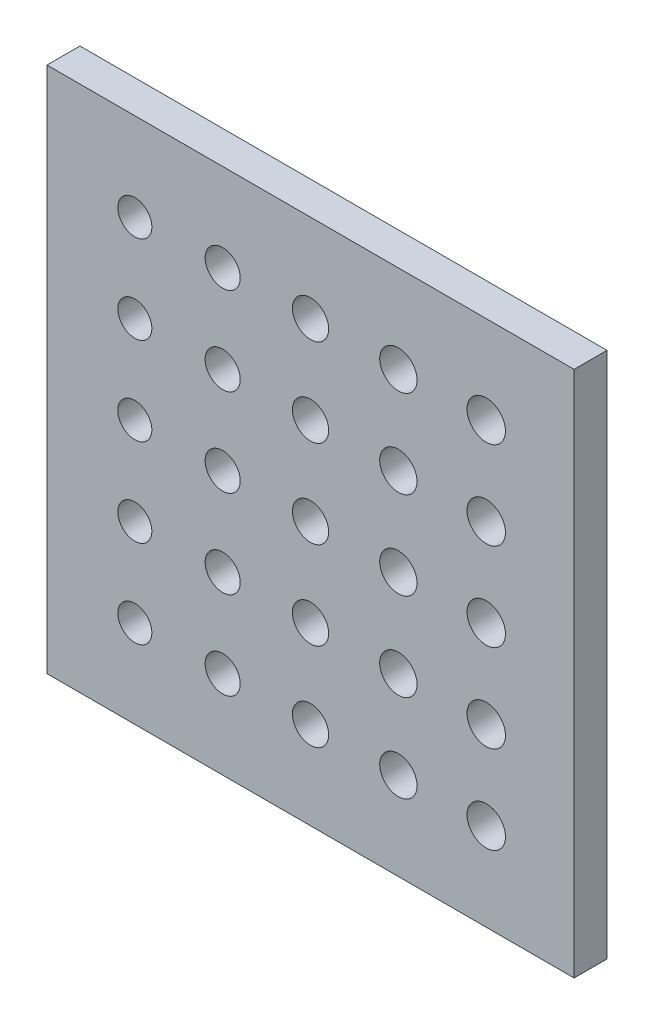
ISO-10303-21;
HEADER;
FILE_DESCRIPTION(('STEP AP214'),'2;1');
FILE_NAME('part.step','',(''),(''),'','','');
FILE_SCHEMA(('AUTOMOTIVE_DESIGN { 1 0 10303 214 1 1 1 1 }'));
ENDSEC;
DATA;
#1=APPLICATION_CONTEXT('core data for automotive mechanical design processes');
#2=APPLICATION_PROTOCOL_DEFINITION('international standard','automotive_design',2000,#1);
#3=PRODUCT_CONTEXT('',#1,'mechanical');
#4=PRODUCT('Part','Part','',(#3));
#5=PRODUCT_RELATED_PRODUCT_CATEGORY('part','',(#4));
#6=PRODUCT_DEFINITION_FORMATION('','',#4);
#7=PRODUCT_DEFINITION_CONTEXT('part definition',#1,'design');
#8=PRODUCT_DEFINITION('design','',#6,#7);
#9=PRODUCT_DEFINITION_SHAPE('','',#8);
#10=(LENGTH_UNIT() NAMED_UNIT(*) SI_UNIT(.MILLI.,.METRE.));
#11=(NAMED_UNIT(*) PLANE_ANGLE_UNIT() SI_UNIT($,.RADIAN.));
#12=(NAMED_UNIT(*) SI_UNIT($,.STERADIAN.) SOLID_ANGLE_UNIT());
#13=UNCERTAINTY_MEASURE_WITH_UNIT(LENGTH_MEASURE(1.E-05),#10,'distance_accuracy_value','');
#14=(GEOMETRIC_REPRESENTATION_CONTEXT(3) GLOBAL_UNCERTAINTY_ASSIGNED_CONTEXT((#13)) GLOBAL_UNIT_ASSIGNED_CONTEXT((#10,
#11,#12)) REPRESENTATION_CONTEXT('',''));
#15=CARTESIAN_POINT('',(0.,0.,0.));
#16=DIRECTION('',(0.,0.,1.));
#17=DIRECTION('',(1.,0.,0.));
#18=AXIS2_PLACEMENT_3D('',#15,#16,#17);
#19=CARTESIAN_POINT('',(0.,0.,3.));
#20=DIRECTION('',(0.,0.,-1.));
#21=DIRECTION('',(-1.,0.,0.));
#22=AXIS2_PLACEMENT_3D('',#19,#20,#21);
#23=PLANE('',#22);
#24=DIRECTION('',(0.,1.,0.));
#25=VECTOR('',#24,1.);
#26=CARTESIAN_POINT('',(48.,48.,3.));
#27=LINE('',#26,#25);
#28=CARTESIAN_POINT('',(48.,0.,3.));
#29=VERTEX_POINT('',#28);
#30=CARTESIAN_POINT('',(48.,48.,3.));
#31=VERTEX_POINT('',#30);
#32=EDGE_CURVE('E91',#29,#31,#27,.T.);
#33=ORIENTED_EDGE('',*,*,#32,.T.);
#34=DIRECTION('',(-1.,0.,0.));
#35=VECTOR('',#34,1.);
#36=CARTESIAN_POINT('',(48.,48.,3.));
#37=LINE('',#36,#35);
#38=CARTESIAN_POINT('',(0.,48.,3.));
#39=VERTEX_POINT('',#38);
#40=EDGE_CURVE('E86',#31,#39,#37,.T.);
#41=ORIENTED_EDGE('',*,*,#40,.T.);
#42=DIRECTION('',(0.,-1.,0.));
#43=VECTOR('',#42,1.);
#44=CARTESIAN_POINT('',(0.,48.,3.));
#45=LINE('',#44,#43);
#46=CARTESIAN_POINT('',(0.,0.,3.));
#47=VERTEX_POINT('',#46);
#48=EDGE_CURVE('E87',#39,#47,#45,.T.);
#49=ORIENTED_EDGE('',*,*,#48,.T.);
#50=DIRECTION('',(1.,0.,0.));
#51=VECTOR('',#50,1.);
#52=CARTESIAN_POINT('',(48.,0.,3.));
#53=LINE('',#52,#51);
#54=EDGE_CURVE('E57',#47,#29,#53,.T.);
#55=ORIENTED_EDGE('',*,*,#54,.T.);
#56=EDGE_LOOP('',(#33,#41,#49,#55));
#57=FACE_BOUND('',#56,.T.);
#58=CARTESIAN_POINT('',(8.,8.,3.));
#59=DIRECTION('',(0.,0.,1.));
#60=DIRECTION('',(1.,0.,0.));
#61=AXIS2_PLACEMENT_3D('',#58,#59,#60);
#62=CIRCLE('',#61,1.55);
#63=CARTESIAN_POINT('',(9.55,8.,3.));
#64=VERTEX_POINT('',#63);
#65=EDGE_CURVE('E106',#64,#64,#62,.T.);
#66=ORIENTED_EDGE('',*,*,#65,.F.);
#67=EDGE_LOOP('',(#66));
#68=FACE_BOUND('',#67,.T.);
#69=CARTESIAN_POINT('',(7.99999999999997,16.,3.));
#70=DIRECTION('',(0.,0.,1.));
#71=DIRECTION('',(1.,0.,0.));
#72=AXIS2_PLACEMENT_3D('',#69,#70,#71);
#73=CIRCLE('',#72,1.55);
#74=CARTESIAN_POINT('',(9.54999999999997,16.,3.));
#75=VERTEX_POINT('',#74);
#76=EDGE_CURVE('E123',#75,#75,#73,.T.);
#77=ORIENTED_EDGE('',*,*,#76,.F.);
#78=EDGE_LOOP('',(#77));
#79=FACE_BOUND('',#78,.T.);
#80=CARTESIAN_POINT('',(7.99999999999994,24.,3.));
#81=DIRECTION('',(0.,0.,1.));
#82=DIRECTION('',(1.,0.,0.));
#83=AXIS2_PLACEMENT_3D('',#80,#81,#82);
#84=CIRCLE('',#83,1.55);
#85=CARTESIAN_POINT('',(9.54999999999994,24.,3.));
#86=VERTEX_POINT('',#85);
#87=EDGE_CURVE('E130',#86,#86,#84,.T.);
#88=ORIENTED_EDGE('',*,*,#87,.F.);
#89=EDGE_LOOP('',(#88));
#90=FACE_BOUND('',#89,.T.);
#91=CARTESIAN_POINT('',(7.99999999999992,32.,3.));
#92=DIRECTION('',(0.,0.,1.));
#93=DIRECTION('',(1.,0.,0.));
#94=AXIS2_PLACEMENT_3D('',#91,#92,#93);
#95=CIRCLE('',#94,1.55);
#96=CARTESIAN_POINT('',(9.54999999999992,32.,3.));
#97=VERTEX_POINT('',#96);
#98=EDGE_CURVE('E133',#97,#97,#95,.T.);
#99=ORIENTED_EDGE('',*,*,#98,.F.);
#100=EDGE_LOOP('',(#99));
#101=FACE_BOUND('',#100,.T.);
#102=CARTESIAN_POINT('',(7.99999999999989,40.,3.));
#103=DIRECTION('',(0.,0.,1.));
#104=DIRECTION('',(1.,0.,0.));
#105=AXIS2_PLACEMENT_3D('',#102,#103,#104);
#106=CIRCLE('',#105,1.55);
#107=CARTESIAN_POINT('',(9.54999999999989,40.,3.));
#108=VERTEX_POINT('',#107);
#109=EDGE_CURVE('E137',#108,#108,#106,.T.);
#110=ORIENTED_EDGE('',*,*,#109,.F.);
#111=EDGE_LOOP('',(#110));
#112=FACE_BOUND('',#111,.T.);
#113=CARTESIAN_POINT('',(16.,8.,3.));
#114=DIRECTION('',(0.,0.,1.));
#115=DIRECTION('',(1.,0.,0.));
#116=AXIS2_PLACEMENT_3D('',#113,#114,#115);
#117=CIRCLE('',#116,1.6);
#118=CARTESIAN_POINT('',(17.6,8.,3.));
#119=VERTEX_POINT('',#118);
#120=EDGE_CURVE('E144',#119,#119,#117,.T.);
#121=ORIENTED_EDGE('',*,*,#120,.F.);
#122=EDGE_LOOP('',(#121));
#123=FACE_BOUND('',#122,.T.);
#124=CARTESIAN_POINT('',(16.,16.,3.));
#125=DIRECTION('',(0.,0.,1.));
#126=DIRECTION('',(1.,0.,0.));
#127=AXIS2_PLACEMENT_3D('',#124,#125,#126);
#128=CIRCLE('',#127,1.6);
#129=CARTESIAN_POINT('',(17.6,16.,3.));
#130=VERTEX_POINT('',#129);
#131=EDGE_CURVE('E151',#130,#130,#128,.T.);
#132=ORIENTED_EDGE('',*,*,#131,.F.);
#133=EDGE_LOOP('',(#132));
#134=FACE_BOUND('',#133,.T.);
#135=CARTESIAN_POINT('',(15.9999999999999,24.,3.));
#136=DIRECTION('',(0.,0.,1.));
#137=DIRECTION('',(1.,0.,0.));
#138=AXIS2_PLACEMENT_3D('',#135,#136,#137);
#139=CIRCLE('',#138,1.6);
#140=CARTESIAN_POINT('',(17.5999999999999,24.,3.));
#141=VERTEX_POINT('',#140);
#142=EDGE_CURVE('E160',#141,#141,#139,.T.);
#143=ORIENTED_EDGE('',*,*,#142,.F.);
#144=EDGE_LOOP('',(#143));
#145=FACE_BOUND('',#144,.T.);
#146=CARTESIAN_POINT('',(15.9999999999999,32.,3.));
#147=DIRECTION('',(0.,0.,1.));
#148=DIRECTION('',(1.,0.,0.));
#149=AXIS2_PLACEMENT_3D('',#146,#147,#148);
#150=CIRCLE('',#149,1.6);
#151=CARTESIAN_POINT('',(17.5999999999999,32.,3.));
#152=VERTEX_POINT('',#151);
#153=EDGE_CURVE('E164',#152,#152,#150,.T.);
#154=ORIENTED_EDGE('',*,*,#153,.F.);
#155=EDGE_LOOP('',(#154));
#156=FACE_BOUND('',#155,.T.);
#157=CARTESIAN_POINT('',(15.9999999999999,40.,3.));
#158=DIRECTION('',(0.,0.,1.));
#159=DIRECTION('',(1.,0.,0.));
#160=AXIS2_PLACEMENT_3D('',#157,#158,#159);
#161=CIRCLE('',#160,1.6);
#162=CARTESIAN_POINT('',(17.5999999999999,40.,3.));
#163=VERTEX_POINT('',#162);
#164=EDGE_CURVE('E170',#163,#163,#161,.T.);
#165=ORIENTED_EDGE('',*,*,#164,.F.);
#166=EDGE_LOOP('',(#165));
#167=FACE_BOUND('',#166,.T.);
#168=CARTESIAN_POINT('',(24.,8.,3.));
#169=DIRECTION('',(0.,0.,1.));
#170=DIRECTION('',(1.,0.,0.));
#171=AXIS2_PLACEMENT_3D('',#168,#169,#170);
#172=CIRCLE('',#171,1.65);
#173=CARTESIAN_POINT('',(25.65,8.,3.));
#174=VERTEX_POINT('',#173);
#175=EDGE_CURVE('E172',#174,#174,#172,.T.);
#176=ORIENTED_EDGE('',*,*,#175,.F.);
#177=EDGE_LOOP('',(#176));
#178=FACE_BOUND('',#177,.T.);
#179=CARTESIAN_POINT('',(24.,16.,3.));
#180=DIRECTION('',(0.,0.,1.));
#181=DIRECTION('',(1.,0.,0.));
#182=AXIS2_PLACEMENT_3D('',#179,#180,#181);
#183=CIRCLE('',#182,1.65);
#184=CARTESIAN_POINT('',(25.65,16.,3.));
#185=VERTEX_POINT('',#184);
#186=EDGE_CURVE('E181',#185,#185,#183,.T.);
#187=ORIENTED_EDGE('',*,*,#186,.F.);
#188=EDGE_LOOP('',(#187));
#189=FACE_BOUND('',#188,.T.);
#190=CARTESIAN_POINT('',(23.9999999999999,24.,3.));
#191=DIRECTION('',(0.,0.,1.));
#192=DIRECTION('',(1.,0.,0.));
#193=AXIS2_PLACEMENT_3D('',#190,#191,#192);
#194=CIRCLE('',#193,1.65);
#195=CARTESIAN_POINT('',(25.6499999999999,24.,3.));
#196=VERTEX_POINT('',#195);
#197=EDGE_CURVE('E190',#196,#196,#194,.T.);
#198=ORIENTED_EDGE('',*,*,#197,.F.);
#199=EDGE_LOOP('',(#198));
#200=FACE_BOUND('',#199,.T.);
#201=CARTESIAN_POINT('',(23.9999999999999,32.,3.));
#202=DIRECTION('',(0.,0.,1.));
#203=DIRECTION('',(1.,0.,0.));
#204=AXIS2_PLACEMENT_3D('',#201,#202,#203);
#205=CIRCLE('',#204,1.65);
#206=CARTESIAN_POINT('',(25.6499999999999,32.,3.));
#207=VERTEX_POINT('',#206);
#208=EDGE_CURVE('E194',#207,#207,#205,.T.);
#209=ORIENTED_EDGE('',*,*,#208,.F.);
#210=EDGE_LOOP('',(#209));
#211=FACE_BOUND('',#210,.T.);
#212=CARTESIAN_POINT('',(23.9999999999999,40.,3.));
#213=DIRECTION('',(0.,0.,1.));
#214=DIRECTION('',(1.,0.,0.));
#215=AXIS2_PLACEMENT_3D('',#212,#213,#214);
#216=CIRCLE('',#215,1.65);
#217=CARTESIAN_POINT('',(25.6499999999999,40.,3.));
#218=VERTEX_POINT('',#217);
#219=EDGE_CURVE('E198',#218,#218,#216,.T.);
#220=ORIENTED_EDGE('',*,*,#219,.F.);
#221=EDGE_LOOP('',(#220));
#222=FACE_BOUND('',#221,.T.);
#223=CARTESIAN_POINT('',(32.,8.,3.));
#224=DIRECTION('',(0.,0.,1.));
#225=DIRECTION('',(1.,0.,0.));
#226=AXIS2_PLACEMENT_3D('',#223,#224,#225);
#227=CIRCLE('',#226,1.7);
#228=CARTESIAN_POINT('',(33.7,8.,3.));
#229=VERTEX_POINT('',#228);
#230=EDGE_CURVE('E203',#229,#229,#227,.T.);
#231=ORIENTED_EDGE('',*,*,#230,.F.);
#232=EDGE_LOOP('',(#231));
#233=FACE_BOUND('',#232,.T.);
#234=CARTESIAN_POINT('',(32.,16.,3.));
#235=DIRECTION('',(0.,0.,1.));
#236=DIRECTION('',(1.,0.,0.));
#237=AXIS2_PLACEMENT_3D('',#234,#235,#236);
#238=CIRCLE('',#237,1.7);
#239=CARTESIAN_POINT('',(33.7,16.,3.));
#240=VERTEX_POINT('',#239);
#241=EDGE_CURVE('E213',#240,#240,#238,.T.);
#242=ORIENTED_EDGE('',*,*,#241,.F.);
#243=EDGE_LOOP('',(#242));
#244=FACE_BOUND('',#243,.T.);
#245=CARTESIAN_POINT('',(31.9999999999999,24.,3.));
#246=DIRECTION('',(0.,0.,1.));
#247=DIRECTION('',(1.,0.,0.));
#248=AXIS2_PLACEMENT_3D('',#245,#246,#247);
#249=CIRCLE('',#248,1.7);
#250=CARTESIAN_POINT('',(33.6999999999999,24.,3.));
#251=VERTEX_POINT('',#250);
#252=EDGE_CURVE('E220',#251,#251,#249,.T.);
#253=ORIENTED_EDGE('',*,*,#252,.F.);
#254=EDGE_LOOP('',(#253));
#255=FACE_BOUND('',#254,.T.);
#256=CARTESIAN_POINT('',(31.9999999999999,32.,3.));
#257=DIRECTION('',(0.,0.,1.));
#258=DIRECTION('',(1.,0.,0.));
#259=AXIS2_PLACEMENT_3D('',#256,#257,#258);
#260=CIRCLE('',#259,1.7);
#261=CARTESIAN_POINT('',(33.6999999999999,32.,3.));
#262=VERTEX_POINT('',#261);
#263=EDGE_CURVE('E223',#262,#262,#260,.T.);
#264=ORIENTED_EDGE('',*,*,#263,.F.);
#265=EDGE_LOOP('',(#264));
#266=FACE_BOUND('',#265,.T.);
#267=CARTESIAN_POINT('',(31.9999999999999,40.,3.));
#268=DIRECTION('',(0.,0.,1.));
#269=DIRECTION('',(1.,0.,0.));
#270=AXIS2_PLACEMENT_3D('',#267,#268,#269);
#271=CIRCLE('',#270,1.7);
#272=CARTESIAN_POINT('',(33.6999999999999,40.,3.));
#273=VERTEX_POINT('',#272);
#274=EDGE_CURVE('E227',#273,#273,#271,.T.);
#275=ORIENTED_EDGE('',*,*,#274,.F.);
#276=EDGE_LOOP('',(#275));
#277=FACE_BOUND('',#276,.T.);
#278=CARTESIAN_POINT('',(40.,8.,3.));
#279=DIRECTION('',(0.,0.,1.));
#280=DIRECTION('',(1.,0.,0.));
#281=AXIS2_PLACEMENT_3D('',#278,#279,#280);
#282=CIRCLE('',#281,1.75);
#283=CARTESIAN_POINT('',(41.75,8.,3.));
#284=VERTEX_POINT('',#283);
#285=EDGE_CURVE('E234',#284,#284,#282,.T.);
#286=ORIENTED_EDGE('',*,*,#285,.F.);
#287=EDGE_LOOP('',(#286));
#288=FACE_BOUND('',#287,.T.);
#289=CARTESIAN_POINT('',(40.,16.,3.));
#290=DIRECTION('',(0.,0.,1.));
#291=DIRECTION('',(1.,0.,0.));
#292=AXIS2_PLACEMENT_3D('',#289,#290,#291);
#293=CIRCLE('',#292,1.75);
#294=CARTESIAN_POINT('',(41.75,16.,3.));
#295=VERTEX_POINT('',#294);
#296=EDGE_CURVE('E241',#295,#295,#293,.T.);
#297=ORIENTED_EDGE('',*,*,#296,.F.);
#298=EDGE_LOOP('',(#297));
#299=FACE_BOUND('',#298,.T.);
#300=CARTESIAN_POINT('',(39.9999999999999,24.,3.));
#301=DIRECTION('',(0.,0.,1.));
#302=DIRECTION('',(1.,0.,0.));
#303=AXIS2_PLACEMENT_3D('',#300,#301,#302);
#304=CIRCLE('',#303,1.75);
#305=CARTESIAN_POINT('',(41.75,24.,3.));
#306=VERTEX_POINT('',#305);
#307=EDGE_CURVE('E250',#306,#306,#304,.T.);
#308=ORIENTED_EDGE('',*,*,#307,.F.);
#309=EDGE_LOOP('',(#308));
#310=FACE_BOUND('',#309,.T.);
#311=CARTESIAN_POINT('',(39.9999999999999,32.,3.));
#312=DIRECTION('',(0.,0.,1.));
#313=DIRECTION('',(1.,0.,0.));
#314=AXIS2_PLACEMENT_3D('',#311,#312,#313);
#315=CIRCLE('',#314,1.75);
#316=CARTESIAN_POINT('',(41.7499999999999,32.,3.));
#317=VERTEX_POINT('',#316);
#318=EDGE_CURVE('E254',#317,#317,#315,.T.);
#319=ORIENTED_EDGE('',*,*,#318,.F.);
#320=EDGE_LOOP('',(#319));
#321=FACE_BOUND('',#320,.T.);
#322=CARTESIAN_POINT('',(39.9999999999999,40.,3.));
#323=DIRECTION('',(0.,0.,1.));
#324=DIRECTION('',(1.,0.,0.));
#325=AXIS2_PLACEMENT_3D('',#322,#323,#324);
#326=CIRCLE('',#325,1.75);
#327=CARTESIAN_POINT('',(41.7499999999999,40.,3.));
#328=VERTEX_POINT('',#327);
#329=EDGE_CURVE('E260',#328,#328,#326,.T.);
#330=ORIENTED_EDGE('',*,*,#329,.F.);
#331=EDGE_LOOP('',(#330));
#332=FACE_BOUND('',#331,.T.);
#333=ADVANCED_FACE('F39',(#57,#68,#79,#90,#101,#112,#123,#134,#145,#156,#167,#178,#189,#200,
#211,#222,#233,#244,#255,#266,#277,#288,#299,#310,#321,#332),#23,.F.);
#334=CARTESIAN_POINT('',(0.,0.,0.));
#335=DIRECTION('',(0.,0.,-1.));
#336=DIRECTION('',(-1.,0.,0.));
#337=AXIS2_PLACEMENT_3D('',#334,#335,#336);
#338=PLANE('',#337);
#339=CARTESIAN_POINT('',(39.9999999999999,32.,0.));
#340=DIRECTION('',(0.,0.,1.));
#341=DIRECTION('',(1.,0.,0.));
#342=AXIS2_PLACEMENT_3D('',#339,#340,#341);
#343=CIRCLE('',#342,1.75);
#344=CARTESIAN_POINT('',(41.7499999999999,32.,0.));
#345=VERTEX_POINT('',#344);
#346=EDGE_CURVE('E258',#345,#345,#343,.T.);
#347=ORIENTED_EDGE('',*,*,#346,.T.);
#348=EDGE_LOOP('',(#347));
#349=FACE_BOUND('',#348,.T.);
#350=CARTESIAN_POINT('',(40.,16.,0.));
#351=DIRECTION('',(0.,0.,1.));
#352=DIRECTION('',(1.,0.,0.));
#353=AXIS2_PLACEMENT_3D('',#350,#351,#352);
#354=CIRCLE('',#353,1.75);
#355=CARTESIAN_POINT('',(41.75,16.,0.));
#356=VERTEX_POINT('',#355);
#357=EDGE_CURVE('E243',#356,#356,#354,.T.);
#358=ORIENTED_EDGE('',*,*,#357,.T.);
#359=EDGE_LOOP('',(#358));
#360=FACE_BOUND('',#359,.T.);
#361=CARTESIAN_POINT('',(31.9999999999999,40.,0.));
#362=DIRECTION('',(0.,0.,1.));
#363=DIRECTION('',(1.,0.,0.));
#364=AXIS2_PLACEMENT_3D('',#361,#362,#363);
#365=CIRCLE('',#364,1.7);
#366=CARTESIAN_POINT('',(33.6999999999999,40.,0.));
#367=VERTEX_POINT('',#366);
#368=EDGE_CURVE('E235',#367,#367,#365,.T.);
#369=ORIENTED_EDGE('',*,*,#368,.T.);
#370=EDGE_LOOP('',(#369));
#371=FACE_BOUND('',#370,.T.);
#372=CARTESIAN_POINT('',(31.9999999999999,24.,0.));
#373=DIRECTION('',(0.,0.,1.));
#374=DIRECTION('',(1.,0.,0.));
#375=AXIS2_PLACEMENT_3D('',#372,#373,#374);
#376=CIRCLE('',#375,1.7);
#377=CARTESIAN_POINT('',(33.6999999999999,24.,0.));
#378=VERTEX_POINT('',#377);
#379=EDGE_CURVE('E217',#378,#378,#376,.T.);
#380=ORIENTED_EDGE('',*,*,#379,.T.);
#381=EDGE_LOOP('',(#380));
#382=FACE_BOUND('',#381,.T.);
#383=CARTESIAN_POINT('',(32.,8.,0.));
#384=DIRECTION('',(0.,0.,1.));
#385=DIRECTION('',(1.,0.,0.));
#386=AXIS2_PLACEMENT_3D('',#383,#384,#385);
#387=CIRCLE('',#386,1.7);
#388=CARTESIAN_POINT('',(33.7,8.,0.));
#389=VERTEX_POINT('',#388);
#390=EDGE_CURVE('E209',#389,#389,#387,.T.);
#391=ORIENTED_EDGE('',*,*,#390,.T.);
#392=EDGE_LOOP('',(#391));
#393=FACE_BOUND('',#392,.T.);
#394=CARTESIAN_POINT('',(23.9999999999999,32.,0.));
#395=DIRECTION('',(0.,0.,1.));
#396=DIRECTION('',(1.,0.,0.));
#397=AXIS2_PLACEMENT_3D('',#394,#395,#396);
#398=CIRCLE('',#397,1.65);
#399=CARTESIAN_POINT('',(25.6499999999999,32.,0.));
#400=VERTEX_POINT('',#399);
#401=EDGE_CURVE('E196',#400,#400,#398,.T.);
#402=ORIENTED_EDGE('',*,*,#401,.T.);
#403=EDGE_LOOP('',(#402));
#404=FACE_BOUND('',#403,.T.);
#405=CARTESIAN_POINT('',(24.,16.,0.));
#406=DIRECTION('',(0.,0.,1.));
#407=DIRECTION('',(1.,0.,0.));
#408=AXIS2_PLACEMENT_3D('',#405,#406,#407);
#409=CIRCLE('',#408,1.65);
#410=CARTESIAN_POINT('',(25.65,16.,0.));
#411=VERTEX_POINT('',#410);
#412=EDGE_CURVE('E182',#411,#411,#409,.T.);
#413=ORIENTED_EDGE('',*,*,#412,.T.);
#414=EDGE_LOOP('',(#413));
#415=FACE_BOUND('',#414,.T.);
#416=CARTESIAN_POINT('',(15.9999999999999,40.,0.));
#417=DIRECTION('',(0.,0.,1.));
#418=DIRECTION('',(1.,0.,0.));
#419=AXIS2_PLACEMENT_3D('',#416,#417,#418);
#420=CIRCLE('',#419,1.6);
#421=CARTESIAN_POINT('',(17.5999999999999,40.,0.));
#422=VERTEX_POINT('',#421);
#423=EDGE_CURVE('E175',#422,#422,#420,.T.);
#424=ORIENTED_EDGE('',*,*,#423,.T.);
#425=EDGE_LOOP('',(#424));
#426=FACE_BOUND('',#425,.T.);
#427=CARTESIAN_POINT('',(15.9999999999999,24.,0.));
#428=DIRECTION('',(0.,0.,1.));
#429=DIRECTION('',(1.,0.,0.));
#430=AXIS2_PLACEMENT_3D('',#427,#428,#429);
#431=CIRCLE('',#430,1.6);
#432=CARTESIAN_POINT('',(17.5999999999999,24.,0.));
#433=VERTEX_POINT('',#432);
#434=EDGE_CURVE('E158',#433,#433,#431,.T.);
#435=ORIENTED_EDGE('',*,*,#434,.T.);
#436=EDGE_LOOP('',(#435));
#437=FACE_BOUND('',#436,.T.);
#438=CARTESIAN_POINT('',(16.,8.,0.));
#439=DIRECTION('',(0.,0.,1.));
#440=DIRECTION('',(1.,0.,0.));
#441=AXIS2_PLACEMENT_3D('',#438,#439,#440);
#442=CIRCLE('',#441,1.6);
#443=CARTESIAN_POINT('',(17.6,8.,0.));
#444=VERTEX_POINT('',#443);
#445=EDGE_CURVE('E149',#444,#444,#442,.T.);
#446=ORIENTED_EDGE('',*,*,#445,.T.);
#447=EDGE_LOOP('',(#446));
#448=FACE_BOUND('',#447,.T.);
#449=CARTESIAN_POINT('',(7.99999999999992,32.,0.));
#450=DIRECTION('',(0.,0.,1.));
#451=DIRECTION('',(1.,0.,0.));
#452=AXIS2_PLACEMENT_3D('',#449,#450,#451);
#453=CIRCLE('',#452,1.55);
#454=CARTESIAN_POINT('',(9.54999999999992,32.,0.));
#455=VERTEX_POINT('',#454);
#456=EDGE_CURVE('E136',#455,#455,#453,.T.);
#457=ORIENTED_EDGE('',*,*,#456,.T.);
#458=EDGE_LOOP('',(#457));
#459=FACE_BOUND('',#458,.T.);
#460=CARTESIAN_POINT('',(7.99999999999997,16.,0.));
#461=DIRECTION('',(0.,0.,1.));
#462=DIRECTION('',(1.,0.,0.));
#463=AXIS2_PLACEMENT_3D('',#460,#461,#462);
#464=CIRCLE('',#463,1.55);
#465=CARTESIAN_POINT('',(9.54999999999997,16.,0.));
#466=VERTEX_POINT('',#465);
#467=EDGE_CURVE('E125',#466,#466,#464,.T.);
#468=ORIENTED_EDGE('',*,*,#467,.T.);
#469=EDGE_LOOP('',(#468));
#470=FACE_BOUND('',#469,.T.);
#471=DIRECTION('',(0.,1.,0.));
#472=VECTOR('',#471,1.);
#473=CARTESIAN_POINT('',(48.,48.,0.));
#474=LINE('',#473,#472);
#475=CARTESIAN_POINT('',(48.,0.,0.));
#476=VERTEX_POINT('',#475);
#477=CARTESIAN_POINT('',(48.,48.,0.));
#478=VERTEX_POINT('',#477);
#479=EDGE_CURVE('E104',#476,#478,#474,.T.);
#480=ORIENTED_EDGE('',*,*,#479,.F.);
#481=DIRECTION('',(1.,0.,0.));
#482=VECTOR('',#481,1.);
#483=CARTESIAN_POINT('',(48.,0.,0.));
#484=LINE('',#483,#482);
#485=CARTESIAN_POINT('',(0.,0.,0.));
#486=VERTEX_POINT('',#485);
#487=EDGE_CURVE('E80',#486,#476,#484,.T.);
#488=ORIENTED_EDGE('',*,*,#487,.F.);
#489=DIRECTION('',(0.,-1.,0.));
#490=VECTOR('',#489,1.);
#491=CARTESIAN_POINT('',(0.,48.,0.));
#492=LINE('',#491,#490);
#493=CARTESIAN_POINT('',(0.,48.,0.));
#494=VERTEX_POINT('',#493);
#495=EDGE_CURVE('E74',#494,#486,#492,.T.);
#496=ORIENTED_EDGE('',*,*,#495,.F.);
#497=DIRECTION('',(-1.,0.,0.));
#498=VECTOR('',#497,1.);
#499=CARTESIAN_POINT('',(48.,48.,0.));
#500=LINE('',#499,#498);
#501=EDGE_CURVE('E94',#478,#494,#500,.T.);
#502=ORIENTED_EDGE('',*,*,#501,.F.);
#503=EDGE_LOOP('',(#480,#488,#496,#502));
#504=FACE_BOUND('',#503,.T.);
#505=CARTESIAN_POINT('',(8.,8.,0.));
#506=DIRECTION('',(0.,0.,1.));
#507=DIRECTION('',(1.,0.,0.));
#508=AXIS2_PLACEMENT_3D('',#505,#506,#507);
#509=CIRCLE('',#508,1.55);
#510=CARTESIAN_POINT('',(9.55,8.,0.));
#511=VERTEX_POINT('',#510);
#512=EDGE_CURVE('E119',#511,#511,#509,.T.);
#513=ORIENTED_EDGE('',*,*,#512,.T.);
#514=EDGE_LOOP('',(#513));
#515=FACE_BOUND('',#514,.T.);
#516=CARTESIAN_POINT('',(7.99999999999994,24.,0.));
#517=DIRECTION('',(0.,0.,1.));
#518=DIRECTION('',(1.,0.,0.));
#519=AXIS2_PLACEMENT_3D('',#516,#517,#518);
#520=CIRCLE('',#519,1.55);
#521=CARTESIAN_POINT('',(9.54999999999994,24.,0.));
#522=VERTEX_POINT('',#521);
#523=EDGE_CURVE('E127',#522,#522,#520,.T.);
#524=ORIENTED_EDGE('',*,*,#523,.T.);
#525=EDGE_LOOP('',(#524));
#526=FACE_BOUND('',#525,.T.);
#527=CARTESIAN_POINT('',(7.99999999999989,40.,0.));
#528=DIRECTION('',(0.,0.,1.));
#529=DIRECTION('',(1.,0.,0.));
#530=AXIS2_PLACEMENT_3D('',#527,#528,#529);
#531=CIRCLE('',#530,1.55);
#532=CARTESIAN_POINT('',(9.54999999999989,40.,0.));
#533=VERTEX_POINT('',#532);
#534=EDGE_CURVE('E145',#533,#533,#531,.T.);
#535=ORIENTED_EDGE('',*,*,#534,.T.);
#536=EDGE_LOOP('',(#535));
#537=FACE_BOUND('',#536,.T.);
#538=CARTESIAN_POINT('',(16.,16.,0.));
#539=DIRECTION('',(0.,0.,1.));
#540=DIRECTION('',(1.,0.,0.));
#541=AXIS2_PLACEMENT_3D('',#538,#539,#540);
#542=CIRCLE('',#541,1.6);
#543=CARTESIAN_POINT('',(17.6,16.,0.));
#544=VERTEX_POINT('',#543);
#545=EDGE_CURVE('E153',#544,#544,#542,.T.);
#546=ORIENTED_EDGE('',*,*,#545,.T.);
#547=EDGE_LOOP('',(#546));
#548=FACE_BOUND('',#547,.T.);
#549=CARTESIAN_POINT('',(15.9999999999999,32.,0.));
#550=DIRECTION('',(0.,0.,1.));
#551=DIRECTION('',(1.,0.,0.));
#552=AXIS2_PLACEMENT_3D('',#549,#550,#551);
#553=CIRCLE('',#552,1.6);
#554=CARTESIAN_POINT('',(17.5999999999999,32.,0.));
#555=VERTEX_POINT('',#554);
#556=EDGE_CURVE('E168',#555,#555,#553,.T.);
#557=ORIENTED_EDGE('',*,*,#556,.T.);
#558=EDGE_LOOP('',(#557));
#559=FACE_BOUND('',#558,.T.);
#560=CARTESIAN_POINT('',(24.,8.,0.));
#561=DIRECTION('',(0.,0.,1.));
#562=DIRECTION('',(1.,0.,0.));
#563=AXIS2_PLACEMENT_3D('',#560,#561,#562);
#564=CIRCLE('',#563,1.65);
#565=CARTESIAN_POINT('',(25.65,8.,0.));
#566=VERTEX_POINT('',#565);
#567=EDGE_CURVE('E178',#566,#566,#564,.T.);
#568=ORIENTED_EDGE('',*,*,#567,.T.);
#569=EDGE_LOOP('',(#568));
#570=FACE_BOUND('',#569,.T.);
#571=CARTESIAN_POINT('',(23.9999999999999,24.,0.));
#572=DIRECTION('',(0.,0.,1.));
#573=DIRECTION('',(1.,0.,0.));
#574=AXIS2_PLACEMENT_3D('',#571,#572,#573);
#575=CIRCLE('',#574,1.65);
#576=CARTESIAN_POINT('',(25.6499999999999,24.,0.));
#577=VERTEX_POINT('',#576);
#578=EDGE_CURVE('E189',#577,#577,#575,.T.);
#579=ORIENTED_EDGE('',*,*,#578,.T.);
#580=EDGE_LOOP('',(#579));
#581=FACE_BOUND('',#580,.T.);
#582=CARTESIAN_POINT('',(23.9999999999999,40.,0.));
#583=DIRECTION('',(0.,0.,1.));
#584=DIRECTION('',(1.,0.,0.));
#585=AXIS2_PLACEMENT_3D('',#582,#583,#584);
#586=CIRCLE('',#585,1.65);
#587=CARTESIAN_POINT('',(25.6499999999999,40.,0.));
#588=VERTEX_POINT('',#587);
#589=EDGE_CURVE('E205',#588,#588,#586,.T.);
#590=ORIENTED_EDGE('',*,*,#589,.T.);
#591=EDGE_LOOP('',(#590));
#592=FACE_BOUND('',#591,.T.);
#593=CARTESIAN_POINT('',(32.,16.,0.));
#594=DIRECTION('',(0.,0.,1.));
#595=DIRECTION('',(1.,0.,0.));
#596=AXIS2_PLACEMENT_3D('',#593,#594,#595);
#597=CIRCLE('',#596,1.7);
#598=CARTESIAN_POINT('',(33.7,16.,0.));
#599=VERTEX_POINT('',#598);
#600=EDGE_CURVE('E215',#599,#599,#597,.T.);
#601=ORIENTED_EDGE('',*,*,#600,.T.);
#602=EDGE_LOOP('',(#601));
#603=FACE_BOUND('',#602,.T.);
#604=CARTESIAN_POINT('',(31.9999999999999,32.,0.));
#605=DIRECTION('',(0.,0.,1.));
#606=DIRECTION('',(1.,0.,0.));
#607=AXIS2_PLACEMENT_3D('',#604,#605,#606);
#608=CIRCLE('',#607,1.7);
#609=CARTESIAN_POINT('',(33.6999999999999,32.,0.));
#610=VERTEX_POINT('',#609);
#611=EDGE_CURVE('E226',#610,#610,#608,.T.);
#612=ORIENTED_EDGE('',*,*,#611,.T.);
#613=EDGE_LOOP('',(#612));
#614=FACE_BOUND('',#613,.T.);
#615=CARTESIAN_POINT('',(40.,8.,0.));
#616=DIRECTION('',(0.,0.,1.));
#617=DIRECTION('',(1.,0.,0.));
#618=AXIS2_PLACEMENT_3D('',#615,#616,#617);
#619=CIRCLE('',#618,1.75);
#620=CARTESIAN_POINT('',(41.75,8.,0.));
#621=VERTEX_POINT('',#620);
#622=EDGE_CURVE('E239',#621,#621,#619,.T.);
#623=ORIENTED_EDGE('',*,*,#622,.T.);
#624=EDGE_LOOP('',(#623));
#625=FACE_BOUND('',#624,.T.);
#626=CARTESIAN_POINT('',(39.9999999999999,24.,0.));
#627=DIRECTION('',(0.,0.,1.));
#628=DIRECTION('',(1.,0.,0.));
#629=AXIS2_PLACEMENT_3D('',#626,#627,#628);
#630=CIRCLE('',#629,1.75);
#631=CARTESIAN_POINT('',(41.75,24.,0.));
#632=VERTEX_POINT('',#631);
#633=EDGE_CURVE('E248',#632,#632,#630,.T.);
#634=ORIENTED_EDGE('',*,*,#633,.T.);
#635=EDGE_LOOP('',(#634));
#636=FACE_BOUND('',#635,.T.);
#637=CARTESIAN_POINT('',(39.9999999999999,40.,0.));
#638=DIRECTION('',(0.,0.,1.));
#639=DIRECTION('',(1.,0.,0.));
#640=AXIS2_PLACEMENT_3D('',#637,#638,#639);
#641=CIRCLE('',#640,1.75);
#642=CARTESIAN_POINT('',(41.7499999999999,40.,0.));
#643=VERTEX_POINT('',#642);
#644=EDGE_CURVE('E265',#643,#643,#641,.T.);
#645=ORIENTED_EDGE('',*,*,#644,.T.);
#646=EDGE_LOOP('',(#645));
#647=FACE_BOUND('',#646,.T.);
#648=ADVANCED_FACE('F114',(#349,#360,#371,#382,#393,#404,#415,#426,#437,#448,#459,#470,#504,
#515,#526,#537,#548,#559,#570,#581,#592,#603,#614,#625,#636,#647),#338,.T.);
#649=CARTESIAN_POINT('',(48.,48.,3.));
#650=DIRECTION('',(-1.,0.,0.));
#651=DIRECTION('',(0.,-1.,0.));
#652=AXIS2_PLACEMENT_3D('',#649,#650,#651);
#653=PLANE('',#652);
#654=ORIENTED_EDGE('',*,*,#479,.T.);
#655=DIRECTION('',(0.,0.,-1.));
#656=VECTOR('',#655,1.);
#657=CARTESIAN_POINT('',(48.,48.,3.));
#658=LINE('',#657,#656);
#659=EDGE_CURVE('E11',#31,#478,#658,.T.);
#660=ORIENTED_EDGE('',*,*,#659,.F.);
#661=ORIENTED_EDGE('',*,*,#32,.F.);
#662=DIRECTION('',(0.,0.,-1.));
#663=VECTOR('',#662,1.);
#664=CARTESIAN_POINT('',(48.,0.,3.));
#665=LINE('',#664,#663);
#666=EDGE_CURVE('E98',#29,#476,#665,.T.);
#667=ORIENTED_EDGE('',*,*,#666,.T.);
#668=EDGE_LOOP('',(#654,#660,#661,#667));
#669=FACE_BOUND('',#668,.T.);
#670=ADVANCED_FACE('F41',(#669),#653,.F.);
#671=CARTESIAN_POINT('',(48.,48.,3.));
#672=DIRECTION('',(0.,-1.,0.));
#673=DIRECTION('',(1.,0.,0.));
#674=AXIS2_PLACEMENT_3D('',#671,#672,#673);
#675=PLANE('',#674);
#676=ORIENTED_EDGE('',*,*,#501,.T.);
#677=DIRECTION('',(0.,0.,-1.));
#678=VECTOR('',#677,1.);
#679=CARTESIAN_POINT('',(0.,48.,3.));
#680=LINE('',#679,#678);
#681=EDGE_CURVE('E48',#39,#494,#680,.T.);
#682=ORIENTED_EDGE('',*,*,#681,.F.);
#683=ORIENTED_EDGE('',*,*,#40,.F.);
#684=ORIENTED_EDGE('',*,*,#659,.T.);
#685=EDGE_LOOP('',(#676,#682,#683,#684));
#686=FACE_BOUND('',#685,.T.);
#687=ADVANCED_FACE('F92',(#686),#675,.F.);
#688=CARTESIAN_POINT('',(0.,48.,3.));
#689=DIRECTION('',(1.,0.,0.));
#690=DIRECTION('',(0.,0.,-1.));
#691=AXIS2_PLACEMENT_3D('',#688,#689,#690);
#692=PLANE('',#691);
#693=ORIENTED_EDGE('',*,*,#495,.T.);
#694=DIRECTION('',(0.,0.,-1.));
#695=VECTOR('',#694,1.);
#696=CARTESIAN_POINT('',(0.,0.,3.));
#697=LINE('',#696,#695);
#698=EDGE_CURVE('E96',#47,#486,#697,.T.);
#699=ORIENTED_EDGE('',*,*,#698,.F.);
#700=ORIENTED_EDGE('',*,*,#48,.F.);
#701=ORIENTED_EDGE('',*,*,#681,.T.);
#702=EDGE_LOOP('',(#693,#699,#700,#701));
#703=FACE_BOUND('',#702,.T.);
#704=ADVANCED_FACE('F100',(#703),#692,.F.);
#705=CARTESIAN_POINT('',(48.,0.,3.));
#706=DIRECTION('',(0.,1.,0.));
#707=DIRECTION('',(0.,0.,1.));
#708=AXIS2_PLACEMENT_3D('',#705,#706,#707);
#709=PLANE('',#708);
#710=ORIENTED_EDGE('',*,*,#487,.T.);
#711=ORIENTED_EDGE('',*,*,#666,.F.);
#712=ORIENTED_EDGE('',*,*,#54,.F.);
#713=ORIENTED_EDGE('',*,*,#698,.T.);
#714=EDGE_LOOP('',(#710,#711,#712,#713));
#715=FACE_BOUND('',#714,.T.);
#716=ADVANCED_FACE('F112',(#715),#709,.F.);
#717=CARTESIAN_POINT('',(8.,8.,3.));
#718=DIRECTION('',(0.,0.,-1.));
#719=DIRECTION('',(-1.,0.,0.));
#720=AXIS2_PLACEMENT_3D('',#717,#718,#719);
#721=CYLINDRICAL_SURFACE('',#720,1.55);
#722=ORIENTED_EDGE('',*,*,#65,.T.);
#723=EDGE_LOOP('',(#722));
#724=FACE_BOUND('',#723,.T.);
#725=ORIENTED_EDGE('',*,*,#512,.F.);
#726=EDGE_LOOP('',(#725));
#727=FACE_BOUND('',#726,.T.);
#728=ADVANCED_FACE('F278',(#724,#727),#721,.F.);
#729=CARTESIAN_POINT('',(7.99999999999997,16.,3.));
#730=DIRECTION('',(0.,0.,-1.));
#731=DIRECTION('',(-1.,0.,0.));
#732=AXIS2_PLACEMENT_3D('',#729,#730,#731);
#733=CYLINDRICAL_SURFACE('',#732,1.55);
#734=ORIENTED_EDGE('',*,*,#76,.T.);
#735=EDGE_LOOP('',(#734));
#736=FACE_BOUND('',#735,.T.);
#737=ORIENTED_EDGE('',*,*,#467,.F.);
#738=EDGE_LOOP('',(#737));
#739=FACE_BOUND('',#738,.T.);
#740=ADVANCED_FACE('F323',(#736,#739),#733,.F.);
#741=CARTESIAN_POINT('',(7.99999999999994,24.,3.));
#742=DIRECTION('',(0.,0.,-1.));
#743=DIRECTION('',(-1.,0.,0.));
#744=AXIS2_PLACEMENT_3D('',#741,#742,#743);
#745=CYLINDRICAL_SURFACE('',#744,1.55);
#746=ORIENTED_EDGE('',*,*,#87,.T.);
#747=EDGE_LOOP('',(#746));
#748=FACE_BOUND('',#747,.T.);
#749=ORIENTED_EDGE('',*,*,#523,.F.);
#750=EDGE_LOOP('',(#749));
#751=FACE_BOUND('',#750,.T.);
#752=ADVANCED_FACE('F332',(#748,#751),#745,.F.);
#753=CARTESIAN_POINT('',(7.99999999999992,32.,3.));
#754=DIRECTION('',(0.,0.,-1.));
#755=DIRECTION('',(-1.,0.,0.));
#756=AXIS2_PLACEMENT_3D('',#753,#754,#755);
#757=CYLINDRICAL_SURFACE('',#756,1.55);
#758=ORIENTED_EDGE('',*,*,#98,.T.);
#759=EDGE_LOOP('',(#758));
#760=FACE_BOUND('',#759,.T.);
#761=ORIENTED_EDGE('',*,*,#456,.F.);
#762=EDGE_LOOP('',(#761));
#763=FACE_BOUND('',#762,.T.);
#764=ADVANCED_FACE('F338',(#760,#763),#757,.F.);
#765=CARTESIAN_POINT('',(7.99999999999989,40.,3.));
#766=DIRECTION('',(0.,0.,-1.));
#767=DIRECTION('',(-1.,0.,0.));
#768=AXIS2_PLACEMENT_3D('',#765,#766,#767);
#769=CYLINDRICAL_SURFACE('',#768,1.55);
#770=ORIENTED_EDGE('',*,*,#109,.T.);
#771=EDGE_LOOP('',(#770));
#772=FACE_BOUND('',#771,.T.);
#773=ORIENTED_EDGE('',*,*,#534,.F.);
#774=EDGE_LOOP('',(#773));
#775=FACE_BOUND('',#774,.T.);
#776=ADVANCED_FACE('F350',(#772,#775),#769,.F.);
#777=CARTESIAN_POINT('',(16.,8.,3.));
#778=DIRECTION('',(0.,0.,-1.));
#779=DIRECTION('',(-1.,0.,0.));
#780=AXIS2_PLACEMENT_3D('',#777,#778,#779);
#781=CYLINDRICAL_SURFACE('',#780,1.6);
#782=ORIENTED_EDGE('',*,*,#120,.T.);
#783=EDGE_LOOP('',(#782));
#784=FACE_BOUND('',#783,.T.);
#785=ORIENTED_EDGE('',*,*,#445,.F.);
#786=EDGE_LOOP('',(#785));
#787=FACE_BOUND('',#786,.T.);
#788=ADVANCED_FACE('F358',(#784,#787),#781,.F.);
#789=CARTESIAN_POINT('',(16.,16.,3.));
#790=DIRECTION('',(0.,0.,-1.));
#791=DIRECTION('',(-1.,0.,0.));
#792=AXIS2_PLACEMENT_3D('',#789,#790,#791);
#793=CYLINDRICAL_SURFACE('',#792,1.6);
#794=ORIENTED_EDGE('',*,*,#131,.T.);
#795=EDGE_LOOP('',(#794));
#796=FACE_BOUND('',#795,.T.);
#797=ORIENTED_EDGE('',*,*,#545,.F.);
#798=EDGE_LOOP('',(#797));
#799=FACE_BOUND('',#798,.T.);
#800=ADVANCED_FACE('F370',(#796,#799),#793,.F.);
#801=CARTESIAN_POINT('',(15.9999999999999,24.,3.));
#802=DIRECTION('',(0.,0.,-1.));
#803=DIRECTION('',(-1.,0.,0.));
#804=AXIS2_PLACEMENT_3D('',#801,#802,#803);
#805=CYLINDRICAL_SURFACE('',#804,1.6);
#806=ORIENTED_EDGE('',*,*,#142,.T.);
#807=EDGE_LOOP('',(#806));
#808=FACE_BOUND('',#807,.T.);
#809=ORIENTED_EDGE('',*,*,#434,.F.);
#810=EDGE_LOOP('',(#809));
#811=FACE_BOUND('',#810,.T.);
#812=ADVANCED_FACE('F376',(#808,#811),#805,.F.);
#813=CARTESIAN_POINT('',(15.9999999999999,32.,3.));
#814=DIRECTION('',(0.,0.,-1.));
#815=DIRECTION('',(-1.,0.,0.));
#816=AXIS2_PLACEMENT_3D('',#813,#814,#815);
#817=CYLINDRICAL_SURFACE('',#816,1.6);
#818=ORIENTED_EDGE('',*,*,#153,.T.);
#819=EDGE_LOOP('',(#818));
#820=FACE_BOUND('',#819,.T.);
#821=ORIENTED_EDGE('',*,*,#556,.F.);
#822=EDGE_LOOP('',(#821));
#823=FACE_BOUND('',#822,.T.);
#824=ADVANCED_FACE('F383',(#820,#823),#817,.F.);
#825=CARTESIAN_POINT('',(15.9999999999999,40.,3.));
#826=DIRECTION('',(0.,0.,-1.));
#827=DIRECTION('',(-1.,0.,0.));
#828=AXIS2_PLACEMENT_3D('',#825,#826,#827);
#829=CYLINDRICAL_SURFACE('',#828,1.6);
#830=ORIENTED_EDGE('',*,*,#164,.T.);
#831=EDGE_LOOP('',(#830));
#832=FACE_BOUND('',#831,.T.);
#833=ORIENTED_EDGE('',*,*,#423,.F.);
#834=EDGE_LOOP('',(#833));
#835=FACE_BOUND('',#834,.T.);
#836=ADVANCED_FACE('F395',(#832,#835),#829,.F.);
#837=CARTESIAN_POINT('',(24.,8.,3.));
#838=DIRECTION('',(0.,0.,-1.));
#839=DIRECTION('',(-1.,0.,0.));
#840=AXIS2_PLACEMENT_3D('',#837,#838,#839);
#841=CYLINDRICAL_SURFACE('',#840,1.65);
#842=ORIENTED_EDGE('',*,*,#175,.T.);
#843=EDGE_LOOP('',(#842));
#844=FACE_BOUND('',#843,.T.);
#845=ORIENTED_EDGE('',*,*,#567,.F.);
#846=EDGE_LOOP('',(#845));
#847=FACE_BOUND('',#846,.T.);
#848=ADVANCED_FACE('F403',(#844,#847),#841,.F.);
#849=CARTESIAN_POINT('',(24.,16.,3.));
#850=DIRECTION('',(0.,0.,-1.));
#851=DIRECTION('',(-1.,0.,0.));
#852=AXIS2_PLACEMENT_3D('',#849,#850,#851);
#853=CYLINDRICAL_SURFACE('',#852,1.65);
#854=ORIENTED_EDGE('',*,*,#186,.T.);
#855=EDGE_LOOP('',(#854));
#856=FACE_BOUND('',#855,.T.);
#857=ORIENTED_EDGE('',*,*,#412,.F.);
#858=EDGE_LOOP('',(#857));
#859=FACE_BOUND('',#858,.T.);
#860=ADVANCED_FACE('F415',(#856,#859),#853,.F.);
#861=CARTESIAN_POINT('',(23.9999999999999,24.,3.));
#862=DIRECTION('',(0.,0.,-1.));
#863=DIRECTION('',(-1.,0.,0.));
#864=AXIS2_PLACEMENT_3D('',#861,#862,#863);
#865=CYLINDRICAL_SURFACE('',#864,1.65);
#866=ORIENTED_EDGE('',*,*,#197,.T.);
#867=EDGE_LOOP('',(#866));
#868=FACE_BOUND('',#867,.T.);
#869=ORIENTED_EDGE('',*,*,#578,.F.);
#870=EDGE_LOOP('',(#869));
#871=FACE_BOUND('',#870,.T.);
#872=ADVANCED_FACE('F421',(#868,#871),#865,.F.);
#873=CARTESIAN_POINT('',(23.9999999999999,32.,3.));
#874=DIRECTION('',(0.,0.,-1.));
#875=DIRECTION('',(-1.,0.,0.));
#876=AXIS2_PLACEMENT_3D('',#873,#874,#875);
#877=CYLINDRICAL_SURFACE('',#876,1.65);
#878=ORIENTED_EDGE('',*,*,#208,.T.);
#879=EDGE_LOOP('',(#878));
#880=FACE_BOUND('',#879,.T.);
#881=ORIENTED_EDGE('',*,*,#401,.F.);
#882=EDGE_LOOP('',(#881));
#883=FACE_BOUND('',#882,.T.);
#884=ADVANCED_FACE('F428',(#880,#883),#877,.F.);
#885=CARTESIAN_POINT('',(23.9999999999999,40.,3.));
#886=DIRECTION('',(0.,0.,-1.));
#887=DIRECTION('',(-1.,0.,0.));
#888=AXIS2_PLACEMENT_3D('',#885,#886,#887);
#889=CYLINDRICAL_SURFACE('',#888,1.65);
#890=ORIENTED_EDGE('',*,*,#219,.T.);
#891=EDGE_LOOP('',(#890));
#892=FACE_BOUND('',#891,.T.);
#893=ORIENTED_EDGE('',*,*,#589,.F.);
#894=EDGE_LOOP('',(#893));
#895=FACE_BOUND('',#894,.T.);
#896=ADVANCED_FACE('F440',(#892,#895),#889,.F.);
#897=CARTESIAN_POINT('',(32.,8.,3.));
#898=DIRECTION('',(0.,0.,-1.));
#899=DIRECTION('',(-1.,0.,0.));
#900=AXIS2_PLACEMENT_3D('',#897,#898,#899);
#901=CYLINDRICAL_SURFACE('',#900,1.7);
#902=ORIENTED_EDGE('',*,*,#230,.T.);
#903=EDGE_LOOP('',(#902));
#904=FACE_BOUND('',#903,.T.);
#905=ORIENTED_EDGE('',*,*,#390,.F.);
#906=EDGE_LOOP('',(#905));
#907=FACE_BOUND('',#906,.T.);
#908=ADVANCED_FACE('F448',(#904,#907),#901,.F.);
#909=CARTESIAN_POINT('',(32.,16.,3.));
#910=DIRECTION('',(0.,0.,-1.));
#911=DIRECTION('',(-1.,0.,0.));
#912=AXIS2_PLACEMENT_3D('',#909,#910,#911);
#913=CYLINDRICAL_SURFACE('',#912,1.7);
#914=ORIENTED_EDGE('',*,*,#241,.T.);
#915=EDGE_LOOP('',(#914));
#916=FACE_BOUND('',#915,.T.);
#917=ORIENTED_EDGE('',*,*,#600,.F.);
#918=EDGE_LOOP('',(#917));
#919=FACE_BOUND('',#918,.T.);
#920=ADVANCED_FACE('F460',(#916,#919),#913,.F.);
#921=CARTESIAN_POINT('',(31.9999999999999,24.,3.));
#922=DIRECTION('',(0.,0.,-1.));
#923=DIRECTION('',(-1.,0.,0.));
#924=AXIS2_PLACEMENT_3D('',#921,#922,#923);
#925=CYLINDRICAL_SURFACE('',#924,1.7);
#926=ORIENTED_EDGE('',*,*,#252,.T.);
#927=EDGE_LOOP('',(#926));
#928=FACE_BOUND('',#927,.T.);
#929=ORIENTED_EDGE('',*,*,#379,.F.);
#930=EDGE_LOOP('',(#929));
#931=FACE_BOUND('',#930,.T.);
#932=ADVANCED_FACE('F466',(#928,#931),#925,.F.);
#933=CARTESIAN_POINT('',(31.9999999999999,32.,3.));
#934=DIRECTION('',(0.,0.,-1.));
#935=DIRECTION('',(-1.,0.,0.));
#936=AXIS2_PLACEMENT_3D('',#933,#934,#935);
#937=CYLINDRICAL_SURFACE('',#936,1.7);
#938=ORIENTED_EDGE('',*,*,#263,.T.);
#939=EDGE_LOOP('',(#938));
#940=FACE_BOUND('',#939,.T.);
#941=ORIENTED_EDGE('',*,*,#611,.F.);
#942=EDGE_LOOP('',(#941));
#943=FACE_BOUND('',#942,.T.);
#944=ADVANCED_FACE('F473',(#940,#943),#937,.F.);
#945=CARTESIAN_POINT('',(31.9999999999999,40.,3.));
#946=DIRECTION('',(0.,0.,-1.));
#947=DIRECTION('',(-1.,0.,0.));
#948=AXIS2_PLACEMENT_3D('',#945,#946,#947);
#949=CYLINDRICAL_SURFACE('',#948,1.7);
#950=ORIENTED_EDGE('',*,*,#274,.T.);
#951=EDGE_LOOP('',(#950));
#952=FACE_BOUND('',#951,.T.);
#953=ORIENTED_EDGE('',*,*,#368,.F.);
#954=EDGE_LOOP('',(#953));
#955=FACE_BOUND('',#954,.T.);
#956=ADVANCED_FACE('F485',(#952,#955),#949,.F.);
#957=CARTESIAN_POINT('',(40.,8.,3.));
#958=DIRECTION('',(0.,0.,-1.));
#959=DIRECTION('',(-1.,0.,0.));
#960=AXIS2_PLACEMENT_3D('',#957,#958,#959);
#961=CYLINDRICAL_SURFACE('',#960,1.75);
#962=ORIENTED_EDGE('',*,*,#285,.T.);
#963=EDGE_LOOP('',(#962));
#964=FACE_BOUND('',#963,.T.);
#965=ORIENTED_EDGE('',*,*,#622,.F.);
#966=EDGE_LOOP('',(#965));
#967=FACE_BOUND('',#966,.T.);
#968=ADVANCED_FACE('F493',(#964,#967),#961,.F.);
#969=CARTESIAN_POINT('',(40.,16.,3.));
#970=DIRECTION('',(0.,0.,-1.));
#971=DIRECTION('',(-1.,0.,0.));
#972=AXIS2_PLACEMENT_3D('',#969,#970,#971);
#973=CYLINDRICAL_SURFACE('',#972,1.75);
#974=ORIENTED_EDGE('',*,*,#296,.T.);
#975=EDGE_LOOP('',(#974));
#976=FACE_BOUND('',#975,.T.);
#977=ORIENTED_EDGE('',*,*,#357,.F.);
#978=EDGE_LOOP('',(#977));
#979=FACE_BOUND('',#978,.T.);
#980=ADVANCED_FACE('F505',(#976,#979),#973,.F.);
#981=CARTESIAN_POINT('',(39.9999999999999,24.,3.));
#982=DIRECTION('',(0.,0.,-1.));
#983=DIRECTION('',(-1.,0.,0.));
#984=AXIS2_PLACEMENT_3D('',#981,#982,#983);
#985=CYLINDRICAL_SURFACE('',#984,1.75);
#986=ORIENTED_EDGE('',*,*,#307,.T.);
#987=EDGE_LOOP('',(#986));
#988=FACE_BOUND('',#987,.T.);
#989=ORIENTED_EDGE('',*,*,#633,.F.);
#990=EDGE_LOOP('',(#989));
#991=FACE_BOUND('',#990,.T.);
#992=ADVANCED_FACE('F511',(#988,#991),#985,.F.);
#993=CARTESIAN_POINT('',(39.9999999999999,32.,3.));
#994=DIRECTION('',(0.,0.,-1.));
#995=DIRECTION('',(-1.,0.,0.));
#996=AXIS2_PLACEMENT_3D('',#993,#994,#995);
#997=CYLINDRICAL_SURFACE('',#996,1.75);
#998=ORIENTED_EDGE('',*,*,#318,.T.);
#999=EDGE_LOOP('',(#998));
#1000=FACE_BOUND('',#999,.T.);
#1001=ORIENTED_EDGE('',*,*,#346,.F.);
#1002=EDGE_LOOP('',(#1001));
#1003=FACE_BOUND('',#1002,.T.);
#1004=ADVANCED_FACE('F518',(#1000,#1003),#997,.F.);
#1005=CARTESIAN_POINT('',(39.9999999999999,40.,3.));
#1006=DIRECTION('',(0.,0.,-1.));
#1007=DIRECTION('',(-1.,0.,0.));
#1008=AXIS2_PLACEMENT_3D('',#1005,#1006,#1007);
#1009=CYLINDRICAL_SURFACE('',#1008,1.75);
#1010=ORIENTED_EDGE('',*,*,#329,.T.);
#1011=EDGE_LOOP('',(#1010));
#1012=FACE_BOUND('',#1011,.T.);
#1013=ORIENTED_EDGE('',*,*,#644,.F.);
#1014=EDGE_LOOP('',(#1013));
#1015=FACE_BOUND('',#1014,.T.);
#1016=ADVANCED_FACE('F268',(#1012,#1015),#1009,.F.);
#1017=CLOSED_SHELL('',(#333,#648,#670,#687,#704,#716,#728,#740,#752,#764,#776,#788,#800,#812,
#824,#836,#848,#860,#872,#884,#896,#908,#920,#932,#944,#956,#968,#980,#992,#1004,#1016));
#1018=MANIFOLD_SOLID_BREP('B2',#1017);
#1019=ADVANCED_BREP_SHAPE_REPRESENTATION('',(#18,#1018),#14);
#1020=SHAPE_DEFINITION_REPRESENTATION(#9,#1019);
ENDSEC;
END-ISO-10303-21;
